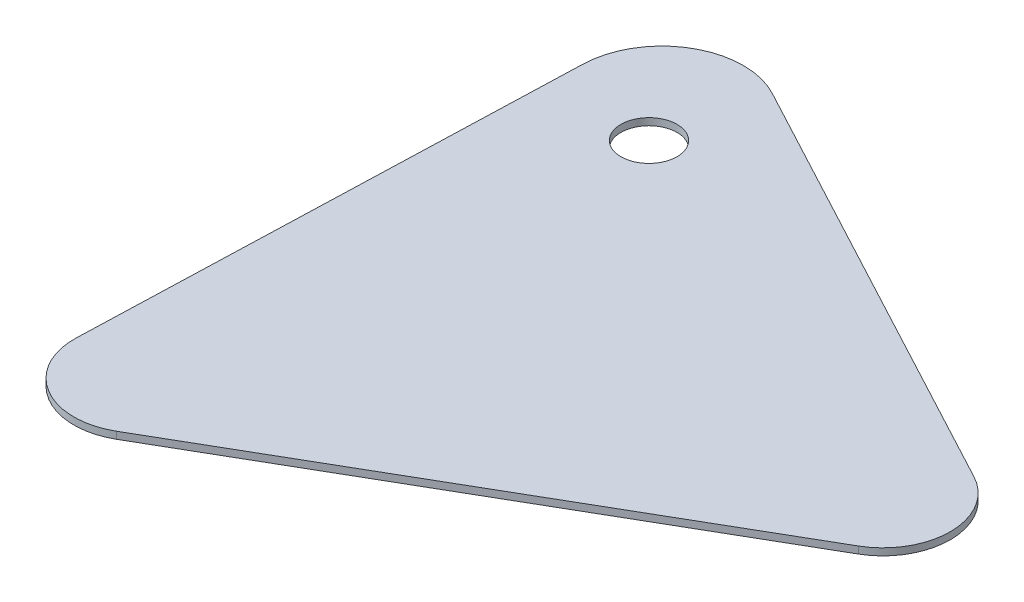
ISO-10303-21;
HEADER;
FILE_DESCRIPTION(('STEP AP214'),'2;1');
FILE_NAME('part.step','',(''),(''),'','','');
FILE_SCHEMA(('AUTOMOTIVE_DESIGN { 1 0 10303 214 1 1 1 1 }'));
ENDSEC;
DATA;
#1=APPLICATION_CONTEXT('core data for automotive mechanical design processes');
#2=APPLICATION_PROTOCOL_DEFINITION('international standard','automotive_design',2000,#1);
#3=PRODUCT_CONTEXT('',#1,'mechanical');
#4=PRODUCT('Part','Part','',(#3));
#5=PRODUCT_RELATED_PRODUCT_CATEGORY('part','',(#4));
#6=PRODUCT_DEFINITION_FORMATION('','',#4);
#7=PRODUCT_DEFINITION_CONTEXT('part definition',#1,'design');
#8=PRODUCT_DEFINITION('design','',#6,#7);
#9=PRODUCT_DEFINITION_SHAPE('','',#8);
#10=(LENGTH_UNIT() NAMED_UNIT(*) SI_UNIT(.MILLI.,.METRE.));
#11=(NAMED_UNIT(*) PLANE_ANGLE_UNIT() SI_UNIT($,.RADIAN.));
#12=(NAMED_UNIT(*) SI_UNIT($,.STERADIAN.) SOLID_ANGLE_UNIT());
#13=UNCERTAINTY_MEASURE_WITH_UNIT(LENGTH_MEASURE(1.E-05),#10,'distance_accuracy_value','');
#14=(GEOMETRIC_REPRESENTATION_CONTEXT(3) GLOBAL_UNCERTAINTY_ASSIGNED_CONTEXT((#13)) GLOBAL_UNIT_ASSIGNED_CONTEXT((#10,
#11,#12)) REPRESENTATION_CONTEXT('',''));
#15=CARTESIAN_POINT('',(0.,0.,0.));
#16=DIRECTION('',(0.,0.,1.));
#17=DIRECTION('',(1.,0.,0.));
#18=AXIS2_PLACEMENT_3D('',#15,#16,#17);
#19=CARTESIAN_POINT('',(75.3216761085348,3.175,-141.050274514535));
#20=DIRECTION('',(-0.47105005040357,0.,0.882106484510115));
#21=DIRECTION('',(0.882106484510115,0.,0.47105005040357));
#22=AXIS2_PLACEMENT_3D('',#19,#20,#21);
#23=PLANE('',#22);
#24=DIRECTION('',(-0.882106484510115,0.,-0.47105005040357));
#25=VECTOR('',#24,1.);
#26=CARTESIAN_POINT('',(75.3216761085348,3.175,-141.050274514535));
#27=LINE('',#26,#25);
#28=CARTESIAN_POINT('',(163.131824622207,3.175,-94.1591387960604));
#29=VERTEX_POINT('',#28);
#30=CARTESIAN_POINT('',(-33.0276091358234,3.175,-198.90943003802));
#31=VERTEX_POINT('',#30);
#32=EDGE_CURVE('E93',#29,#31,#27,.T.);
#33=ORIENTED_EDGE('',*,*,#32,.F.);
#34=DIRECTION('',(0.,-1.,0.));
#35=VECTOR('',#34,1.);
#36=CARTESIAN_POINT('',(163.131824622207,3.175,-94.1591387960604));
#37=LINE('',#36,#35);
#38=CARTESIAN_POINT('',(163.131824622207,0.,-94.1591387960604));
#39=VERTEX_POINT('',#38);
#40=EDGE_CURVE('E116',#29,#39,#37,.T.);
#41=ORIENTED_EDGE('',*,*,#40,.T.);
#42=DIRECTION('',(-0.882106484510115,0.,-0.47105005040357));
#43=VECTOR('',#42,1.);
#44=CARTESIAN_POINT('',(75.3216761085348,0.,-141.050274514535));
#45=LINE('',#44,#43);
#46=CARTESIAN_POINT('',(-33.0276091358234,0.,-198.90943003802));
#47=VERTEX_POINT('',#46);
#48=EDGE_CURVE('E114',#39,#47,#45,.T.);
#49=ORIENTED_EDGE('',*,*,#48,.T.);
#50=DIRECTION('',(0.,-1.,0.));
#51=VECTOR('',#50,1.);
#52=CARTESIAN_POINT('',(-33.0276091358234,3.175,-198.90943003802));
#53=LINE('',#52,#51);
#54=EDGE_CURVE('E108',#31,#47,#53,.T.);
#55=ORIENTED_EDGE('',*,*,#54,.F.);
#56=EDGE_LOOP('',(#33,#41,#49,#55));
#57=FACE_BOUND('',#56,.T.);
#58=ADVANCED_FACE('F39',(#57),#23,.F.);
#59=CARTESIAN_POINT('',(-50.3949070706444,3.175,-166.386758373726));
#60=DIRECTION('',(0.,-1.,0.));
#61=DIRECTION('',(0.,0.,-1.));
#62=AXIS2_PLACEMENT_3D('',#59,#60,#61);
#63=CYLINDRICAL_SURFACE('',#62,36.869326136239);
#64=CARTESIAN_POINT('',(-50.3949070706444,0.,-166.386758373726));
#65=DIRECTION('',(0.,1.,0.));
#66=DIRECTION('',(0.,0.,1.));
#67=AXIS2_PLACEMENT_3D('',#64,#65,#66);
#68=CIRCLE('',#67,36.869326136239);
#69=CARTESIAN_POINT('',(-87.2440158982745,0.,-167.607572999225));
#70=VERTEX_POINT('',#69);
#71=EDGE_CURVE('E147',#47,#70,#68,.T.);
#72=ORIENTED_EDGE('',*,*,#71,.T.);
#73=DIRECTION('',(0.,-1.,0.));
#74=VECTOR('',#73,1.);
#75=CARTESIAN_POINT('',(-87.2440158982745,3.175,-167.607572999225));
#76=LINE('',#75,#74);
#77=CARTESIAN_POINT('',(-87.2440158982745,3.175,-167.607572999225));
#78=VERTEX_POINT('',#77);
#79=EDGE_CURVE('E110',#78,#70,#76,.T.);
#80=ORIENTED_EDGE('',*,*,#79,.F.);
#81=CARTESIAN_POINT('',(-50.3949070706444,3.175,-166.386758373726));
#82=DIRECTION('',(0.,1.,0.));
#83=DIRECTION('',(0.,0.,1.));
#84=AXIS2_PLACEMENT_3D('',#81,#82,#83);
#85=CIRCLE('',#84,36.869326136239);
#86=EDGE_CURVE('E96',#31,#78,#85,.T.);
#87=ORIENTED_EDGE('',*,*,#86,.F.);
#88=ORIENTED_EDGE('',*,*,#54,.T.);
#89=EDGE_LOOP('',(#72,#80,#87,#88));
#90=FACE_BOUND('',#89,.T.);
#91=ADVANCED_FACE('F107',(#90),#63,.T.);
#92=CARTESIAN_POINT('',(-92.6951288993744,3.175,-3.07099880223011));
#93=DIRECTION('',(0.999451649630529,0.,0.0331119321516255));
#94=DIRECTION('',(0.0331119321516255,0.,-0.999451649630529));
#95=AXIS2_PLACEMENT_3D('',#92,#93,#94);
#96=PLANE('',#95);
#97=DIRECTION('',(-0.0331119321516255,0.,0.999451649630529));
#98=VECTOR('',#97,1.);
#99=CARTESIAN_POINT('',(-92.6951288993744,0.,-3.07099880223011));
#100=LINE('',#99,#98);
#101=CARTESIAN_POINT('',(-94.6073195079338,0.,54.6466254481802));
#102=VERTEX_POINT('',#101);
#103=EDGE_CURVE('E145',#70,#102,#100,.T.);
#104=ORIENTED_EDGE('',*,*,#103,.T.);
#105=DIRECTION('',(0.,-1.,0.));
#106=VECTOR('',#105,1.);
#107=CARTESIAN_POINT('',(-94.6073195079338,3.175,54.6466254481802));
#108=LINE('',#107,#106);
#109=CARTESIAN_POINT('',(-94.6073195079338,3.175,54.6466254481802));
#110=VERTEX_POINT('',#109);
#111=EDGE_CURVE('E11',#102,#110,#108,.F.);
#112=ORIENTED_EDGE('',*,*,#111,.T.);
#113=DIRECTION('',(-0.0331119321516255,0.,0.999451649630529));
#114=VECTOR('',#113,1.);
#115=CARTESIAN_POINT('',(-92.6951288993744,3.175,-3.07099880223011));
#116=LINE('',#115,#114);
#117=EDGE_CURVE('E111',#78,#110,#116,.T.);
#118=ORIENTED_EDGE('',*,*,#117,.F.);
#119=ORIENTED_EDGE('',*,*,#79,.T.);
#120=EDGE_LOOP('',(#104,#112,#118,#119));
#121=FACE_BOUND('',#120,.T.);
#122=ADVANCED_FACE('F146',(#121),#96,.F.);
#123=CARTESIAN_POINT('',(23.303693429844,3.175,40.3631810244989));
#124=DIRECTION('',(-0.5,0.,-0.866025403784439));
#125=DIRECTION('',(-0.866025403784439,0.,0.5));
#126=AXIS2_PLACEMENT_3D('',#123,#124,#125);
#127=PLANE('',#126);
#128=DIRECTION('',(0.866025403784439,0.,-0.5));
#129=VECTOR('',#128,1.);
#130=CARTESIAN_POINT('',(23.303693429844,0.,40.3631810244989));
#131=LINE('',#130,#129);
#132=CARTESIAN_POINT('',(-48.9040332271952,0.,82.0523314475115));
#133=VERTEX_POINT('',#132);
#134=CARTESIAN_POINT('',(164.014219085906,0.,-40.8760788408424));
#135=VERTEX_POINT('',#134);
#136=EDGE_CURVE('E103',#133,#135,#131,.T.);
#137=ORIENTED_EDGE('',*,*,#136,.T.);
#138=DIRECTION('',(0.,-1.,0.));
#139=VECTOR('',#138,1.);
#140=CARTESIAN_POINT('',(164.014219085906,3.175,-40.8760788408424));
#141=LINE('',#140,#139);
#142=CARTESIAN_POINT('',(164.014219085906,3.175,-40.8760788408424));
#143=VERTEX_POINT('',#142);
#144=EDGE_CURVE('E60',#135,#143,#141,.F.);
#145=ORIENTED_EDGE('',*,*,#144,.T.);
#146=DIRECTION('',(0.866025403784439,0.,-0.5));
#147=VECTOR('',#146,1.);
#148=CARTESIAN_POINT('',(23.303693429844,3.175,40.3631810244989));
#149=LINE('',#148,#147);
#150=CARTESIAN_POINT('',(-48.9040332271952,3.175,82.0523314475115));
#151=VERTEX_POINT('',#150);
#152=EDGE_CURVE('E120',#151,#143,#149,.T.);
#153=ORIENTED_EDGE('',*,*,#152,.F.);
#154=DIRECTION('',(0.,-1.,0.));
#155=VECTOR('',#154,1.);
#156=CARTESIAN_POINT('',(-48.9040332271952,3.175,82.0523314475115));
#157=LINE('',#156,#155);
#158=EDGE_CURVE('E131',#151,#133,#157,.T.);
#159=ORIENTED_EDGE('',*,*,#158,.T.);
#160=EDGE_LOOP('',(#137,#145,#153,#159));
#161=FACE_BOUND('',#160,.T.);
#162=ADVANCED_FACE('F139',(#161),#127,.F.);
#163=CARTESIAN_POINT('',(0.,3.175,0.));
#164=DIRECTION('',(0.,1.,0.));
#165=DIRECTION('',(0.,0.,1.));
#166=AXIS2_PLACEMENT_3D('',#163,#164,#165);
#167=PLANE('',#166);
#168=CARTESIAN_POINT('',(-42.3558125170489,3.175,-152.462638160048));
#169=DIRECTION('',(0.,1.,0.));
#170=DIRECTION('',(0.,0.,1.));
#171=AXIS2_PLACEMENT_3D('',#168,#169,#170);
#172=CIRCLE('',#171,12.7);
#173=CARTESIAN_POINT('',(-42.3558125170489,3.175,-139.762638160048));
#174=VERTEX_POINT('',#173);
#175=EDGE_CURVE('E126',#174,#174,#172,.T.);
#176=ORIENTED_EDGE('',*,*,#175,.F.);
#177=EDGE_LOOP('',(#176));
#178=FACE_BOUND('',#177,.T.);
#179=ORIENTED_EDGE('',*,*,#152,.T.);
#180=CARTESIAN_POINT('',(148.774219085906,3.175,-67.2725331481921));
#181=DIRECTION('',(0.,1.,0.));
#182=DIRECTION('',(0.,0.,1.));
#183=AXIS2_PLACEMENT_3D('',#180,#181,#182);
#184=CIRCLE('',#183,30.48);
#185=EDGE_CURVE('E47',#143,#29,#184,.T.);
#186=ORIENTED_EDGE('',*,*,#185,.T.);
#187=ORIENTED_EDGE('',*,*,#32,.T.);
#188=ORIENTED_EDGE('',*,*,#86,.T.);
#189=ORIENTED_EDGE('',*,*,#117,.T.);
#190=CARTESIAN_POINT('',(-64.1440332271952,3.175,55.6558771401618));
#191=DIRECTION('',(0.,1.,0.));
#192=DIRECTION('',(0.,0.,1.));
#193=AXIS2_PLACEMENT_3D('',#190,#191,#192);
#194=CIRCLE('',#193,30.48);
#195=EDGE_CURVE('E135',#110,#151,#194,.T.);
#196=ORIENTED_EDGE('',*,*,#195,.T.);
#197=EDGE_LOOP('',(#179,#186,#187,#188,#189,#196));
#198=FACE_BOUND('',#197,.T.);
#199=ADVANCED_FACE('F95',(#178,#198),#167,.T.);
#200=CARTESIAN_POINT('',(0.,0.,0.));
#201=DIRECTION('',(0.,1.,0.));
#202=DIRECTION('',(0.,0.,1.));
#203=AXIS2_PLACEMENT_3D('',#200,#201,#202);
#204=PLANE('',#203);
#205=CARTESIAN_POINT('',(-42.3558125170489,0.,-152.462638160048));
#206=DIRECTION('',(0.,1.,0.));
#207=DIRECTION('',(0.,0.,1.));
#208=AXIS2_PLACEMENT_3D('',#205,#206,#207);
#209=CIRCLE('',#208,12.7);
#210=CARTESIAN_POINT('',(-42.3558125170489,0.,-139.762638160048));
#211=VERTEX_POINT('',#210);
#212=EDGE_CURVE('E124',#211,#211,#209,.T.);
#213=ORIENTED_EDGE('',*,*,#212,.T.);
#214=EDGE_LOOP('',(#213));
#215=FACE_BOUND('',#214,.T.);
#216=ORIENTED_EDGE('',*,*,#48,.F.);
#217=CARTESIAN_POINT('',(148.774219085906,0.,-67.2725331481921));
#218=DIRECTION('',(0.,1.,0.));
#219=DIRECTION('',(0.,0.,1.));
#220=AXIS2_PLACEMENT_3D('',#217,#218,#219);
#221=CIRCLE('',#220,30.48);
#222=EDGE_CURVE('E129',#39,#135,#221,.F.);
#223=ORIENTED_EDGE('',*,*,#222,.T.);
#224=ORIENTED_EDGE('',*,*,#136,.F.);
#225=CARTESIAN_POINT('',(-64.1440332271952,0.,55.6558771401618));
#226=DIRECTION('',(0.,1.,0.));
#227=DIRECTION('',(0.,0.,1.));
#228=AXIS2_PLACEMENT_3D('',#225,#226,#227);
#229=CIRCLE('',#228,30.48);
#230=EDGE_CURVE('E118',#133,#102,#229,.F.);
#231=ORIENTED_EDGE('',*,*,#230,.T.);
#232=ORIENTED_EDGE('',*,*,#103,.F.);
#233=ORIENTED_EDGE('',*,*,#71,.F.);
#234=EDGE_LOOP('',(#216,#223,#224,#231,#232,#233));
#235=FACE_BOUND('',#234,.T.);
#236=ADVANCED_FACE('F144',(#215,#235),#204,.F.);
#237=CARTESIAN_POINT('',(-42.3558125170489,-73.025,-152.462638160048));
#238=DIRECTION('',(0.,1.,0.));
#239=DIRECTION('',(0.,0.,1.));
#240=AXIS2_PLACEMENT_3D('',#237,#238,#239);
#241=CYLINDRICAL_SURFACE('',#240,12.7);
#242=CARTESIAN_POINT('',(-42.3558125170489,3.175,-139.762638160048));
#243=CARTESIAN_POINT('',(-42.3558125170489,3.14192708333333,-139.762638160048));
#244=CARTESIAN_POINT('',(-42.3558125170489,3.10885416666666,-139.762638160048));
#245=CARTESIAN_POINT('',(-42.3558125170489,3.04270833333333,-139.762638160048));
#246=CARTESIAN_POINT('',(-42.3558125170489,3.00963541666667,-139.762638160048));
#247=CARTESIAN_POINT('',(-42.3558125170489,2.94348958333333,-139.762638160048));
#248=CARTESIAN_POINT('',(-42.3558125170489,2.91041666666667,-139.762638160048));
#249=CARTESIAN_POINT('',(-42.3558125170489,2.84427083333333,-139.762638160048));
#250=CARTESIAN_POINT('',(-42.3558125170489,2.81119791666666,-139.762638160048));
#251=CARTESIAN_POINT('',(-42.3558125170489,2.74505208333333,-139.762638160048));
#252=CARTESIAN_POINT('',(-42.3558125170489,2.71197916666667,-139.762638160048));
#253=CARTESIAN_POINT('',(-42.3558125170489,2.64583333333333,-139.762638160048));
#254=CARTESIAN_POINT('',(-42.3558125170489,2.61276041666667,-139.762638160048));
#255=CARTESIAN_POINT('',(-42.3558125170489,2.54661458333333,-139.762638160048));
#256=CARTESIAN_POINT('',(-42.3558125170489,2.51354166666666,-139.762638160048));
#257=CARTESIAN_POINT('',(-42.3558125170489,2.44739583333332,-139.762638160048));
#258=CARTESIAN_POINT('',(-42.3558125170489,2.41432291666666,-139.762638160048));
#259=CARTESIAN_POINT('',(-42.3558125170489,2.34817708333332,-139.762638160048));
#260=CARTESIAN_POINT('',(-42.3558125170489,2.31510416666666,-139.762638160048));
#261=CARTESIAN_POINT('',(-42.3558125170489,2.24895833333333,-139.762638160048));
#262=CARTESIAN_POINT('',(-42.3558125170489,2.21588541666666,-139.762638160048));
#263=CARTESIAN_POINT('',(-42.3558125170489,2.14973958333332,-139.762638160048));
#264=CARTESIAN_POINT('',(-42.3558125170489,2.11666666666666,-139.762638160048));
#265=CARTESIAN_POINT('',(-42.3558125170489,2.05052083333332,-139.762638160048));
#266=CARTESIAN_POINT('',(-42.3558125170489,2.01744791666666,-139.762638160048));
#267=CARTESIAN_POINT('',(-42.3558125170489,1.95130208333333,-139.762638160048));
#268=CARTESIAN_POINT('',(-42.3558125170489,1.91822916666666,-139.762638160048));
#269=CARTESIAN_POINT('',(-42.3558125170489,1.85208333333332,-139.762638160048));
#270=CARTESIAN_POINT('',(-42.3558125170489,1.81901041666666,-139.762638160048));
#271=CARTESIAN_POINT('',(-42.3558125170489,1.75286458333332,-139.762638160048));
#272=CARTESIAN_POINT('',(-42.3558125170489,1.71979166666666,-139.762638160048));
#273=CARTESIAN_POINT('',(-42.3558125170489,1.65364583333333,-139.762638160048));
#274=CARTESIAN_POINT('',(-42.3558125170489,1.62057291666666,-139.762638160048));
#275=CARTESIAN_POINT('',(-42.3558125170489,1.55442708333332,-139.762638160048));
#276=CARTESIAN_POINT('',(-42.3558125170489,1.52135416666666,-139.762638160048));
#277=CARTESIAN_POINT('',(-42.3558125170489,1.45520833333332,-139.762638160048));
#278=CARTESIAN_POINT('',(-42.3558125170489,1.42213541666666,-139.762638160048));
#279=CARTESIAN_POINT('',(-42.3558125170489,1.35598958333333,-139.762638160048));
#280=CARTESIAN_POINT('',(-42.3558125170489,1.32291666666666,-139.762638160048));
#281=CARTESIAN_POINT('',(-42.3558125170489,1.25677083333332,-139.762638160048));
#282=CARTESIAN_POINT('',(-42.3558125170489,1.22369791666666,-139.762638160048));
#283=CARTESIAN_POINT('',(-42.3558125170489,1.15755208333332,-139.762638160048));
#284=CARTESIAN_POINT('',(-42.3558125170489,1.12447916666666,-139.762638160048));
#285=CARTESIAN_POINT('',(-42.3558125170489,1.05833333333333,-139.762638160048));
#286=CARTESIAN_POINT('',(-42.3558125170489,1.02526041666666,-139.762638160048));
#287=CARTESIAN_POINT('',(-42.3558125170489,0.959114583333323,-139.762638160048));
#288=CARTESIAN_POINT('',(-42.3558125170489,0.926041666666655,-139.762638160048));
#289=CARTESIAN_POINT('',(-42.3558125170489,0.859895833333323,-139.762638160048));
#290=CARTESIAN_POINT('',(-42.3558125170489,0.826822916666659,-139.762638160048));
#291=CARTESIAN_POINT('',(-42.3558125170489,0.760677083333328,-139.762638160048));
#292=CARTESIAN_POINT('',(-42.3558125170489,0.727604166666659,-139.762638160048));
#293=CARTESIAN_POINT('',(-42.3558125170489,0.661458333333323,-139.762638160048));
#294=CARTESIAN_POINT('',(-42.3558125170489,0.628385416666655,-139.762638160048));
#295=CARTESIAN_POINT('',(-42.3558125170489,0.562239583333318,-139.762638160048));
#296=CARTESIAN_POINT('',(-42.3558125170489,0.52916666666665,-139.762638160048));
#297=CARTESIAN_POINT('',(-42.3558125170489,0.463020833333318,-139.762638160048));
#298=CARTESIAN_POINT('',(-42.3558125170489,0.429947916666655,-139.762638160048));
#299=CARTESIAN_POINT('',(-42.3558125170489,0.363802083333323,-139.762638160048));
#300=CARTESIAN_POINT('',(-42.3558125170489,0.330729166666655,-139.762638160048));
#301=CARTESIAN_POINT('',(-42.3558125170489,0.264583333333318,-139.762638160048));
#302=CARTESIAN_POINT('',(-42.3558125170489,0.23151041666665,-139.762638160048));
#303=CARTESIAN_POINT('',(-42.3558125170489,0.165364583333318,-139.762638160048));
#304=CARTESIAN_POINT('',(-42.3558125170489,0.132291666666654,-139.762638160048));
#305=CARTESIAN_POINT('',(-42.3558125170489,0.0661458333333226,-139.762638160048));
#306=CARTESIAN_POINT('',(-42.3558125170489,0.0330729166666544,-139.762638160048));
#307=CARTESIAN_POINT('',(-42.3558125170489,0.,-139.762638160048));
#308=B_SPLINE_CURVE_WITH_KNOTS('',3,(#242,#243,#244,#245,#246,#247,#248,#249,#250,#251,#252,
#253,#254,#255,#256,#257,#258,#259,#260,#261,#262,#263,#264,#265,#266,#267,#268,#269,#270,#271,
#272,#273,#274,#275,#276,#277,#278,#279,#280,#281,#282,#283,#284,#285,#286,#287,#288,#289,#290,
#291,#292,#293,#294,#295,#296,#297,#298,#299,#300,#301,#302,#303,#304,#305,#306,#307),
.UNSPECIFIED.,.F.,.F.,(4,2,2,2,2,2,2,2,2,2,2,2,2,2,2,2,2,2,2,2,2,2,2,2,2,2,2,2,2,2,2,2,4),(0.,
0.0992187500000047,0.198437499999995,0.29765625,0.396875000000005,0.496093749999996,0.5953125,
0.694531250000005,0.79375000000001,0.892968750000001,0.992187500000005,1.09140625000001,
1.190625,1.28984375000001,1.38906250000001,1.48828125,1.58750000000001,1.68671875000001,
1.7859375,1.88515625000001,1.98437500000001,2.08359375,2.18281250000001,2.28203125000001,
2.38125,2.48046875000001,2.57968750000001,2.67890625000002,2.77812500000001,2.87734375000001,
2.97656250000002,3.07578125000001,3.17500000000001),.UNSPECIFIED.);
#309=EDGE_CURVE('BSEAM156',#174,#211,#308,.T.);
#310=ORIENTED_EDGE('',*,*,#175,.T.);
#311=ORIENTED_EDGE('',*,*,#212,.F.);
#312=ORIENTED_EDGE('',*,*,#309,.T.);
#313=ORIENTED_EDGE('',*,*,#309,.F.);
#314=EDGE_LOOP('',(#310,#312,#311,#313));
#315=FACE_BOUND('',#314,.T.);
#316=ADVANCED_FACE('F156',(#315),#241,.F.);
#317=CARTESIAN_POINT('',(148.774219085906,3.175,-67.2725331481921));
#318=DIRECTION('',(0.,-1.,0.));
#319=DIRECTION('',(0.,0.,-1.));
#320=AXIS2_PLACEMENT_3D('',#317,#318,#319);
#321=CYLINDRICAL_SURFACE('',#320,30.48);
#322=ORIENTED_EDGE('',*,*,#185,.F.);
#323=ORIENTED_EDGE('',*,*,#144,.F.);
#324=ORIENTED_EDGE('',*,*,#222,.F.);
#325=ORIENTED_EDGE('',*,*,#40,.F.);
#326=EDGE_LOOP('',(#322,#323,#324,#325));
#327=FACE_BOUND('',#326,.T.);
#328=ADVANCED_FACE('F176',(#327),#321,.T.);
#329=CARTESIAN_POINT('',(-64.1440332271952,3.175,55.6558771401618));
#330=DIRECTION('',(0.,-1.,0.));
#331=DIRECTION('',(0.,0.,-1.));
#332=AXIS2_PLACEMENT_3D('',#329,#330,#331);
#333=CYLINDRICAL_SURFACE('',#332,30.48);
#334=ORIENTED_EDGE('',*,*,#195,.F.);
#335=ORIENTED_EDGE('',*,*,#111,.F.);
#336=ORIENTED_EDGE('',*,*,#230,.F.);
#337=ORIENTED_EDGE('',*,*,#158,.F.);
#338=EDGE_LOOP('',(#334,#335,#336,#337));
#339=FACE_BOUND('',#338,.T.);
#340=ADVANCED_FACE('F41',(#339),#333,.T.);
#341=CLOSED_SHELL('',(#58,#91,#122,#162,#199,#236,#316,#328,#340));
#342=MANIFOLD_SOLID_BREP('B2',#341);
#343=ADVANCED_BREP_SHAPE_REPRESENTATION('',(#18,#342),#14);
#344=SHAPE_DEFINITION_REPRESENTATION(#9,#343);
ENDSEC;
END-ISO-10303-21;
